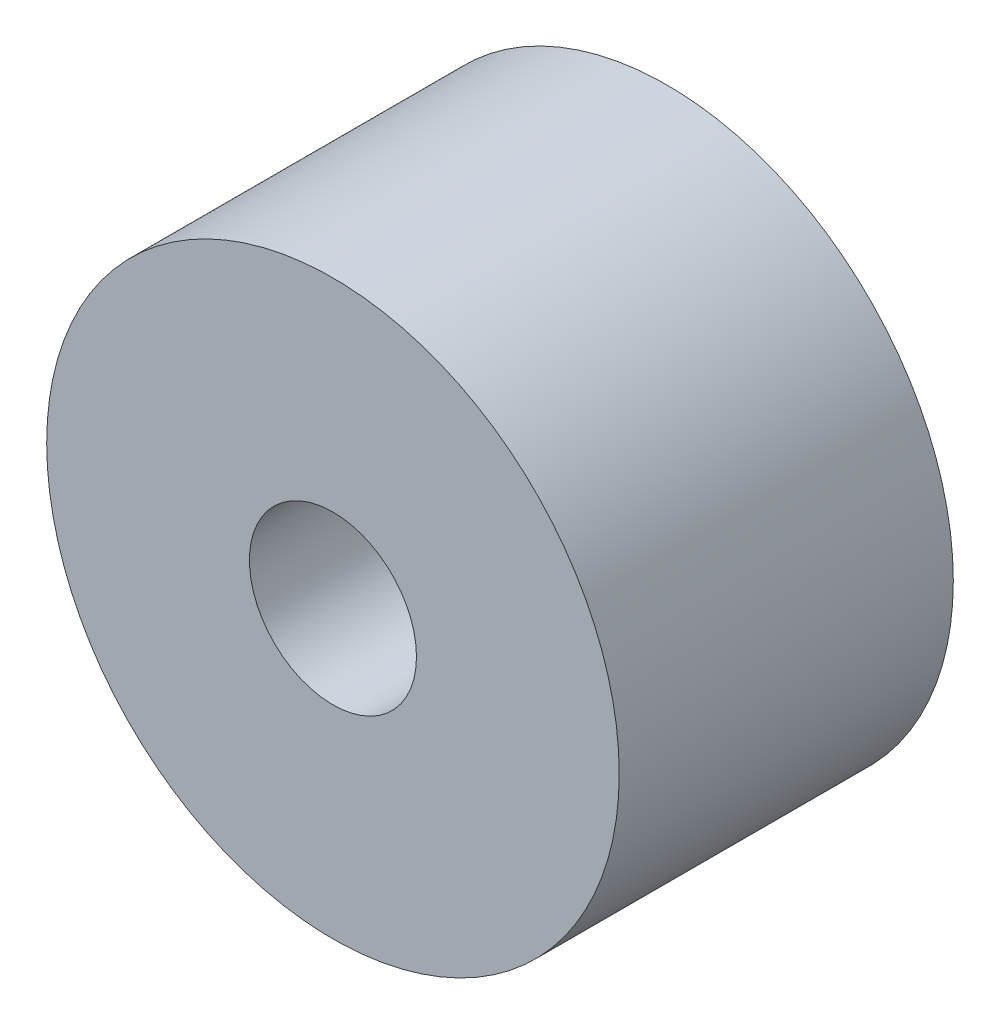
ISO-10303-21;
HEADER;
FILE_DESCRIPTION(('STEP AP214'),'2;1');
FILE_NAME('part.step','',(''),(''),'','','');
FILE_SCHEMA(('AUTOMOTIVE_DESIGN { 1 0 10303 214 1 1 1 1 }'));
ENDSEC;
DATA;
#1=APPLICATION_CONTEXT('core data for automotive mechanical design processes');
#2=APPLICATION_PROTOCOL_DEFINITION('international standard','automotive_design',2000,#1);
#3=PRODUCT_CONTEXT('',#1,'mechanical');
#4=PRODUCT('Part','Part','',(#3));
#5=PRODUCT_RELATED_PRODUCT_CATEGORY('part','',(#4));
#6=PRODUCT_DEFINITION_FORMATION('','',#4);
#7=PRODUCT_DEFINITION_CONTEXT('part definition',#1,'design');
#8=PRODUCT_DEFINITION('design','',#6,#7);
#9=PRODUCT_DEFINITION_SHAPE('','',#8);
#10=(LENGTH_UNIT() NAMED_UNIT(*) SI_UNIT(.MILLI.,.METRE.));
#11=(NAMED_UNIT(*) PLANE_ANGLE_UNIT() SI_UNIT($,.RADIAN.));
#12=(NAMED_UNIT(*) SI_UNIT($,.STERADIAN.) SOLID_ANGLE_UNIT());
#13=UNCERTAINTY_MEASURE_WITH_UNIT(LENGTH_MEASURE(1.E-05),#10,'distance_accuracy_value','');
#14=(GEOMETRIC_REPRESENTATION_CONTEXT(3) GLOBAL_UNCERTAINTY_ASSIGNED_CONTEXT((#13)) GLOBAL_UNIT_ASSIGNED_CONTEXT((#10,
#11,#12)) REPRESENTATION_CONTEXT('',''));
#15=CARTESIAN_POINT('',(0.,0.,0.));
#16=DIRECTION('',(0.,0.,1.));
#17=DIRECTION('',(1.,0.,0.));
#18=AXIS2_PLACEMENT_3D('',#15,#16,#17);
#19=CARTESIAN_POINT('',(0.,0.,12.7));
#20=DIRECTION('',(0.,0.,1.));
#21=DIRECTION('',(1.,0.,0.));
#22=AXIS2_PLACEMENT_3D('',#19,#20,#21);
#23=PLANE('',#22);
#24=CARTESIAN_POINT('',(0.,0.,12.7));
#25=DIRECTION('',(0.,0.,1.));
#26=DIRECTION('',(1.,0.,0.));
#27=AXIS2_PLACEMENT_3D('',#24,#25,#26);
#28=CIRCLE('',#27,10.8824141);
#29=CARTESIAN_POINT('',(10.8824141,0.,12.7));
#30=VERTEX_POINT('',#29);
#31=EDGE_CURVE('E10',#30,#30,#28,.T.);
#32=ORIENTED_EDGE('',*,*,#31,.T.);
#33=EDGE_LOOP('',(#32));
#34=FACE_BOUND('',#33,.T.);
#35=CARTESIAN_POINT('',(0.,0.,12.7));
#36=DIRECTION('',(0.,0.,1.));
#37=DIRECTION('',(1.,0.,0.));
#38=AXIS2_PLACEMENT_3D('',#35,#36,#37);
#39=CIRCLE('',#38,3.175);
#40=CARTESIAN_POINT('',(3.175,0.,12.7));
#41=VERTEX_POINT('',#40);
#42=EDGE_CURVE('E50',#41,#41,#39,.T.);
#43=ORIENTED_EDGE('',*,*,#42,.F.);
#44=EDGE_LOOP('',(#43));
#45=FACE_BOUND('',#44,.T.);
#46=ADVANCED_FACE('F37',(#34,#45),#23,.T.);
#47=CARTESIAN_POINT('',(0.,0.,0.));
#48=DIRECTION('',(0.,0.,1.));
#49=DIRECTION('',(1.,0.,0.));
#50=AXIS2_PLACEMENT_3D('',#47,#48,#49);
#51=PLANE('',#50);
#52=CARTESIAN_POINT('',(0.,0.,0.));
#53=DIRECTION('',(0.,0.,1.));
#54=DIRECTION('',(1.,0.,0.));
#55=AXIS2_PLACEMENT_3D('',#52,#53,#54);
#56=CIRCLE('',#55,10.8824141);
#57=CARTESIAN_POINT('',(10.8824141,0.,0.));
#58=VERTEX_POINT('',#57);
#59=EDGE_CURVE('E41',#58,#58,#56,.T.);
#60=ORIENTED_EDGE('',*,*,#59,.F.);
#61=EDGE_LOOP('',(#60));
#62=FACE_BOUND('',#61,.T.);
#63=CARTESIAN_POINT('',(0.,0.,0.));
#64=DIRECTION('',(0.,0.,1.));
#65=DIRECTION('',(1.,0.,0.));
#66=AXIS2_PLACEMENT_3D('',#63,#64,#65);
#67=CIRCLE('',#66,3.175);
#68=CARTESIAN_POINT('',(3.175,0.,0.));
#69=VERTEX_POINT('',#68);
#70=EDGE_CURVE('E52',#69,#69,#67,.T.);
#71=ORIENTED_EDGE('',*,*,#70,.T.);
#72=EDGE_LOOP('',(#71));
#73=FACE_BOUND('',#72,.T.);
#74=ADVANCED_FACE('F64',(#62,#73),#51,.F.);
#75=CARTESIAN_POINT('',(0.,0.,12.7));
#76=DIRECTION('',(0.,0.,-1.));
#77=DIRECTION('',(-1.,0.,0.));
#78=AXIS2_PLACEMENT_3D('',#75,#76,#77);
#79=CYLINDRICAL_SURFACE('',#78,10.8824141);
#80=ORIENTED_EDGE('',*,*,#31,.F.);
#81=EDGE_LOOP('',(#80));
#82=FACE_BOUND('',#81,.T.);
#83=ORIENTED_EDGE('',*,*,#59,.T.);
#84=EDGE_LOOP('',(#83));
#85=FACE_BOUND('',#84,.T.);
#86=ADVANCED_FACE('F39',(#82,#85),#79,.T.);
#87=CARTESIAN_POINT('',(0.,0.,12.7));
#88=DIRECTION('',(0.,0.,-1.));
#89=DIRECTION('',(-1.,0.,0.));
#90=AXIS2_PLACEMENT_3D('',#87,#88,#89);
#91=CYLINDRICAL_SURFACE('',#90,3.175);
#92=ORIENTED_EDGE('',*,*,#42,.T.);
#93=EDGE_LOOP('',(#92));
#94=FACE_BOUND('',#93,.T.);
#95=ORIENTED_EDGE('',*,*,#70,.F.);
#96=EDGE_LOOP('',(#95));
#97=FACE_BOUND('',#96,.T.);
#98=ADVANCED_FACE('F60',(#94,#97),#91,.F.);
#99=CLOSED_SHELL('',(#46,#74,#86,#98));
#100=MANIFOLD_SOLID_BREP('B2',#99);
#101=ADVANCED_BREP_SHAPE_REPRESENTATION('',(#18,#100),#14);
#102=SHAPE_DEFINITION_REPRESENTATION(#9,#101);
ENDSEC;
END-ISO-10303-21;
